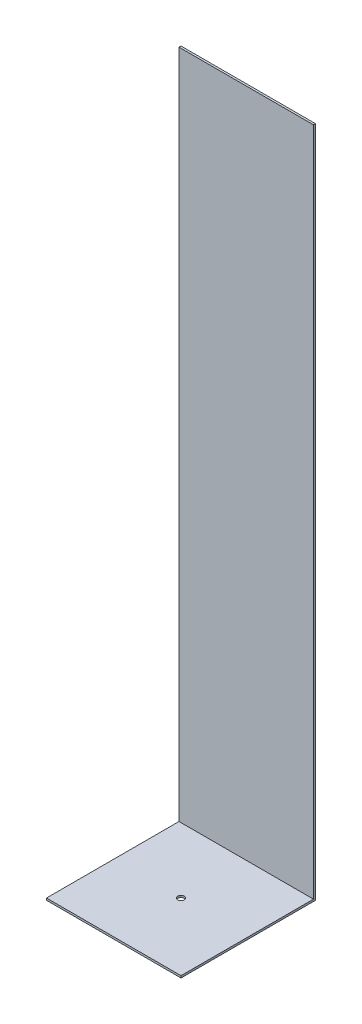
ISO-10303-21;
HEADER;
FILE_DESCRIPTION(('STEP AP214'),'2;1');
FILE_NAME('part.step','',(''),(''),'','','');
FILE_SCHEMA(('AUTOMOTIVE_DESIGN { 1 0 10303 214 1 1 1 1 }'));
ENDSEC;
DATA;
#1=APPLICATION_CONTEXT('core data for automotive mechanical design processes');
#2=APPLICATION_PROTOCOL_DEFINITION('international standard','automotive_design',2000,#1);
#3=PRODUCT_CONTEXT('',#1,'mechanical');
#4=PRODUCT('Part','Part','',(#3));
#5=PRODUCT_RELATED_PRODUCT_CATEGORY('part','',(#4));
#6=PRODUCT_DEFINITION_FORMATION('','',#4);
#7=PRODUCT_DEFINITION_CONTEXT('part definition',#1,'design');
#8=PRODUCT_DEFINITION('design','',#6,#7);
#9=PRODUCT_DEFINITION_SHAPE('','',#8);
#10=(LENGTH_UNIT() NAMED_UNIT(*) SI_UNIT(.MILLI.,.METRE.));
#11=(NAMED_UNIT(*) PLANE_ANGLE_UNIT() SI_UNIT($,.RADIAN.));
#12=(NAMED_UNIT(*) SI_UNIT($,.STERADIAN.) SOLID_ANGLE_UNIT());
#13=UNCERTAINTY_MEASURE_WITH_UNIT(LENGTH_MEASURE(1.E-05),#10,'distance_accuracy_value','');
#14=(GEOMETRIC_REPRESENTATION_CONTEXT(3) GLOBAL_UNCERTAINTY_ASSIGNED_CONTEXT((#13)) GLOBAL_UNIT_ASSIGNED_CONTEXT((#10,
#11,#12)) REPRESENTATION_CONTEXT('',''));
#15=CARTESIAN_POINT('',(0.,0.,0.));
#16=DIRECTION('',(0.,0.,1.));
#17=DIRECTION('',(1.,0.,0.));
#18=AXIS2_PLACEMENT_3D('',#15,#16,#17);
#19=CARTESIAN_POINT('',(-200.,-497.,-1.53080849893419E-13));
#20=DIRECTION('',(0.,1.,0.));
#21=DIRECTION('',(0.,0.,1.));
#22=AXIS2_PLACEMENT_3D('',#19,#20,#21);
#23=PLANE('',#22);
#24=CARTESIAN_POINT('',(-100.,-497.,99.9999999999999));
#25=DIRECTION('',(0.,1.,0.));
#26=DIRECTION('',(0.,0.,1.));
#27=AXIS2_PLACEMENT_3D('',#24,#25,#26);
#28=CIRCLE('',#27,5.00000000000001);
#29=CARTESIAN_POINT('',(-100.,-497.,105.));
#30=VERTEX_POINT('',#29);
#31=EDGE_CURVE('E132',#30,#30,#28,.T.);
#32=ORIENTED_EDGE('',*,*,#31,.F.);
#33=EDGE_LOOP('',(#32));
#34=FACE_BOUND('',#33,.T.);
#35=DIRECTION('',(0.,0.,-1.));
#36=VECTOR('',#35,1.);
#37=CARTESIAN_POINT('',(0.,-497.,-1.53080849893419E-13));
#38=LINE('',#37,#36);
#39=CARTESIAN_POINT('',(0.,-497.,2.99999999999985));
#40=VERTEX_POINT('',#39);
#41=CARTESIAN_POINT('',(0.,-497.,200.));
#42=VERTEX_POINT('',#41);
#43=EDGE_CURVE('E127',#40,#42,#38,.F.);
#44=ORIENTED_EDGE('',*,*,#43,.F.);
#45=DIRECTION('',(1.,0.,0.));
#46=VECTOR('',#45,1.);
#47=CARTESIAN_POINT('',(-200.,-497.,2.99999999999985));
#48=LINE('',#47,#46);
#49=CARTESIAN_POINT('',(-200.,-497.,2.99999999999985));
#50=VERTEX_POINT('',#49);
#51=EDGE_CURVE('E11',#50,#40,#48,.T.);
#52=ORIENTED_EDGE('',*,*,#51,.F.);
#53=DIRECTION('',(0.,0.,-1.));
#54=VECTOR('',#53,1.);
#55=CARTESIAN_POINT('',(-200.,-497.,-1.53080849893419E-13));
#56=LINE('',#55,#54);
#57=CARTESIAN_POINT('',(-200.,-497.,200.));
#58=VERTEX_POINT('',#57);
#59=EDGE_CURVE('E147',#50,#58,#56,.F.);
#60=ORIENTED_EDGE('',*,*,#59,.T.);
#61=DIRECTION('',(1.,0.,0.));
#62=VECTOR('',#61,1.);
#63=CARTESIAN_POINT('',(-200.,-497.,200.));
#64=LINE('',#63,#62);
#65=EDGE_CURVE('E42',#58,#42,#64,.T.);
#66=ORIENTED_EDGE('',*,*,#65,.T.);
#67=EDGE_LOOP('',(#44,#52,#60,#66));
#68=FACE_BOUND('',#67,.T.);
#69=ADVANCED_FACE('F39',(#34,#68),#23,.T.);
#70=CARTESIAN_POINT('',(-200.,500.,3.00000000000015));
#71=DIRECTION('',(0.,0.,1.));
#72=DIRECTION('',(0.,-1.,0.));
#73=AXIS2_PLACEMENT_3D('',#70,#71,#72);
#74=PLANE('',#73);
#75=DIRECTION('',(0.,-1.,0.));
#76=VECTOR('',#75,1.);
#77=CARTESIAN_POINT('',(0.,500.,3.00000000000015));
#78=LINE('',#77,#76);
#79=CARTESIAN_POINT('',(0.,500.,3.00000000000015));
#80=VERTEX_POINT('',#79);
#81=EDGE_CURVE('E144',#80,#40,#78,.T.);
#82=ORIENTED_EDGE('',*,*,#81,.F.);
#83=DIRECTION('',(1.,0.,0.));
#84=VECTOR('',#83,1.);
#85=CARTESIAN_POINT('',(-200.,500.,3.00000000000015));
#86=LINE('',#85,#84);
#87=CARTESIAN_POINT('',(-200.,500.,3.00000000000015));
#88=VERTEX_POINT('',#87);
#89=EDGE_CURVE('E49',#88,#80,#86,.T.);
#90=ORIENTED_EDGE('',*,*,#89,.F.);
#91=DIRECTION('',(0.,-1.,0.));
#92=VECTOR('',#91,1.);
#93=CARTESIAN_POINT('',(-200.,500.,3.00000000000015));
#94=LINE('',#93,#92);
#95=EDGE_CURVE('E103',#88,#50,#94,.T.);
#96=ORIENTED_EDGE('',*,*,#95,.T.);
#97=ORIENTED_EDGE('',*,*,#51,.T.);
#98=EDGE_LOOP('',(#82,#90,#96,#97));
#99=FACE_BOUND('',#98,.T.);
#100=ADVANCED_FACE('F163',(#99),#74,.T.);
#101=CARTESIAN_POINT('',(-200.,500.,3.00000000000015));
#102=DIRECTION('',(0.,-1.,0.));
#103=DIRECTION('',(0.,0.,-1.));
#104=AXIS2_PLACEMENT_3D('',#101,#102,#103);
#105=PLANE('',#104);
#106=DIRECTION('',(0.,0.,-1.));
#107=VECTOR('',#106,1.);
#108=CARTESIAN_POINT('',(0.,500.,3.00000000000015));
#109=LINE('',#108,#107);
#110=CARTESIAN_POINT('',(0.,500.,1.53080849893419E-13));
#111=VERTEX_POINT('',#110);
#112=EDGE_CURVE('E109',#80,#111,#109,.T.);
#113=ORIENTED_EDGE('',*,*,#112,.T.);
#114=DIRECTION('',(1.,0.,0.));
#115=VECTOR('',#114,1.);
#116=CARTESIAN_POINT('',(-200.,500.,1.53080849893419E-13));
#117=LINE('',#116,#115);
#118=CARTESIAN_POINT('',(-200.,500.,1.53080849893419E-13));
#119=VERTEX_POINT('',#118);
#120=EDGE_CURVE('E107',#119,#111,#117,.T.);
#121=ORIENTED_EDGE('',*,*,#120,.F.);
#122=DIRECTION('',(0.,0.,-1.));
#123=VECTOR('',#122,1.);
#124=CARTESIAN_POINT('',(-200.,500.,3.00000000000015));
#125=LINE('',#124,#123);
#126=EDGE_CURVE('E97',#88,#119,#125,.T.);
#127=ORIENTED_EDGE('',*,*,#126,.F.);
#128=ORIENTED_EDGE('',*,*,#89,.T.);
#129=EDGE_LOOP('',(#113,#121,#127,#128));
#130=FACE_BOUND('',#129,.T.);
#131=ADVANCED_FACE('F108',(#130),#105,.F.);
#132=CARTESIAN_POINT('',(-200.,500.,1.53080849893419E-13));
#133=DIRECTION('',(0.,0.,1.));
#134=DIRECTION('',(0.,-1.,0.));
#135=AXIS2_PLACEMENT_3D('',#132,#133,#134);
#136=PLANE('',#135);
#137=DIRECTION('',(0.,-1.,0.));
#138=VECTOR('',#137,1.);
#139=CARTESIAN_POINT('',(0.,500.,1.53080849893419E-13));
#140=LINE('',#139,#138);
#141=CARTESIAN_POINT('',(0.,-500.,-1.53080849893419E-13));
#142=VERTEX_POINT('',#141);
#143=EDGE_CURVE('E139',#111,#142,#140,.T.);
#144=ORIENTED_EDGE('',*,*,#143,.T.);
#145=DIRECTION('',(1.,0.,0.));
#146=VECTOR('',#145,1.);
#147=CARTESIAN_POINT('',(-200.,-500.,-1.53080849893419E-13));
#148=LINE('',#147,#146);
#149=CARTESIAN_POINT('',(-200.,-500.,-1.53080849893419E-13));
#150=VERTEX_POINT('',#149);
#151=EDGE_CURVE('E113',#150,#142,#148,.T.);
#152=ORIENTED_EDGE('',*,*,#151,.F.);
#153=DIRECTION('',(0.,-1.,0.));
#154=VECTOR('',#153,1.);
#155=CARTESIAN_POINT('',(-200.,500.,1.53080849893419E-13));
#156=LINE('',#155,#154);
#157=EDGE_CURVE('E101',#119,#150,#156,.T.);
#158=ORIENTED_EDGE('',*,*,#157,.F.);
#159=ORIENTED_EDGE('',*,*,#120,.T.);
#160=EDGE_LOOP('',(#144,#152,#158,#159));
#161=FACE_BOUND('',#160,.T.);
#162=ADVANCED_FACE('F115',(#161),#136,.F.);
#163=CARTESIAN_POINT('',(-200.,-500.,-1.53080849893419E-13));
#164=DIRECTION('',(0.,1.,0.));
#165=DIRECTION('',(0.,0.,1.));
#166=AXIS2_PLACEMENT_3D('',#163,#164,#165);
#167=PLANE('',#166);
#168=CARTESIAN_POINT('',(-100.,-500.,99.9999999999999));
#169=DIRECTION('',(0.,-1.,0.));
#170=DIRECTION('',(0.,0.,-1.));
#171=AXIS2_PLACEMENT_3D('',#168,#169,#170);
#172=CIRCLE('',#171,5.00000000000001);
#173=CARTESIAN_POINT('',(-100.,-500.,94.9999999999999));
#174=VERTEX_POINT('',#173);
#175=EDGE_CURVE('E198',#174,#174,#172,.T.);
#176=ORIENTED_EDGE('',*,*,#175,.F.);
#177=EDGE_LOOP('',(#176));
#178=FACE_BOUND('',#177,.T.);
#179=DIRECTION('',(0.,0.,1.));
#180=VECTOR('',#179,1.);
#181=CARTESIAN_POINT('',(0.,-500.,-1.53080849893419E-13));
#182=LINE('',#181,#180);
#183=CARTESIAN_POINT('',(0.,-500.,200.));
#184=VERTEX_POINT('',#183);
#185=EDGE_CURVE('E136',#142,#184,#182,.T.);
#186=ORIENTED_EDGE('',*,*,#185,.T.);
#187=DIRECTION('',(1.,0.,0.));
#188=VECTOR('',#187,1.);
#189=CARTESIAN_POINT('',(-200.,-500.,200.));
#190=LINE('',#189,#188);
#191=CARTESIAN_POINT('',(-200.,-500.,200.));
#192=VERTEX_POINT('',#191);
#193=EDGE_CURVE('E152',#192,#184,#190,.T.);
#194=ORIENTED_EDGE('',*,*,#193,.F.);
#195=DIRECTION('',(0.,0.,1.));
#196=VECTOR('',#195,1.);
#197=CARTESIAN_POINT('',(-200.,-500.,-1.53080849893419E-13));
#198=LINE('',#197,#196);
#199=EDGE_CURVE('E119',#150,#192,#198,.T.);
#200=ORIENTED_EDGE('',*,*,#199,.F.);
#201=ORIENTED_EDGE('',*,*,#151,.T.);
#202=EDGE_LOOP('',(#186,#194,#200,#201));
#203=FACE_BOUND('',#202,.T.);
#204=ADVANCED_FACE('F177',(#178,#203),#167,.F.);
#205=CARTESIAN_POINT('',(-200.,-500.,200.));
#206=DIRECTION('',(0.,0.,-1.));
#207=DIRECTION('',(-1.,0.,0.));
#208=AXIS2_PLACEMENT_3D('',#205,#206,#207);
#209=PLANE('',#208);
#210=DIRECTION('',(0.,1.,0.));
#211=VECTOR('',#210,1.);
#212=CARTESIAN_POINT('',(0.,-500.,200.));
#213=LINE('',#212,#211);
#214=EDGE_CURVE('E131',#184,#42,#213,.T.);
#215=ORIENTED_EDGE('',*,*,#214,.T.);
#216=ORIENTED_EDGE('',*,*,#65,.F.);
#217=DIRECTION('',(0.,1.,0.));
#218=VECTOR('',#217,1.);
#219=CARTESIAN_POINT('',(-200.,-500.,200.));
#220=LINE('',#219,#218);
#221=EDGE_CURVE('E89',#192,#58,#220,.T.);
#222=ORIENTED_EDGE('',*,*,#221,.F.);
#223=ORIENTED_EDGE('',*,*,#193,.T.);
#224=EDGE_LOOP('',(#215,#216,#222,#223));
#225=FACE_BOUND('',#224,.T.);
#226=ADVANCED_FACE('F159',(#225),#209,.F.);
#227=CARTESIAN_POINT('',(-200.,0.,0.));
#228=DIRECTION('',(1.,0.,0.));
#229=DIRECTION('',(0.,0.,-1.));
#230=AXIS2_PLACEMENT_3D('',#227,#228,#229);
#231=PLANE('',#230);
#232=ORIENTED_EDGE('',*,*,#59,.F.);
#233=ORIENTED_EDGE('',*,*,#95,.F.);
#234=ORIENTED_EDGE('',*,*,#126,.T.);
#235=ORIENTED_EDGE('',*,*,#157,.T.);
#236=ORIENTED_EDGE('',*,*,#199,.T.);
#237=ORIENTED_EDGE('',*,*,#221,.T.);
#238=EDGE_LOOP('',(#232,#233,#234,#235,#236,#237));
#239=FACE_BOUND('',#238,.T.);
#240=ADVANCED_FACE('F99',(#239),#231,.F.);
#241=CARTESIAN_POINT('',(0.,0.,0.));
#242=DIRECTION('',(1.,0.,0.));
#243=DIRECTION('',(0.,0.,-1.));
#244=AXIS2_PLACEMENT_3D('',#241,#242,#243);
#245=PLANE('',#244);
#246=ORIENTED_EDGE('',*,*,#43,.T.);
#247=ORIENTED_EDGE('',*,*,#214,.F.);
#248=ORIENTED_EDGE('',*,*,#185,.F.);
#249=ORIENTED_EDGE('',*,*,#143,.F.);
#250=ORIENTED_EDGE('',*,*,#112,.F.);
#251=ORIENTED_EDGE('',*,*,#81,.T.);
#252=EDGE_LOOP('',(#246,#247,#248,#249,#250,#251));
#253=FACE_BOUND('',#252,.T.);
#254=ADVANCED_FACE('F162',(#253),#245,.T.);
#255=CARTESIAN_POINT('',(-100.,-490.,99.9999999999999));
#256=DIRECTION('',(0.,-1.,0.));
#257=DIRECTION('',(0.,0.,-1.));
#258=AXIS2_PLACEMENT_3D('',#255,#256,#257);
#259=CYLINDRICAL_SURFACE('',#258,5.00000000000001);
#260=ORIENTED_EDGE('',*,*,#31,.T.);
#261=EDGE_LOOP('',(#260));
#262=FACE_BOUND('',#261,.T.);
#263=ORIENTED_EDGE('',*,*,#175,.T.);
#264=EDGE_LOOP('',(#263));
#265=FACE_BOUND('',#264,.T.);
#266=ADVANCED_FACE('F187',(#262,#265),#259,.F.);
#267=CLOSED_SHELL('',(#69,#100,#131,#162,#204,#226,#240,#254,#266));
#268=MANIFOLD_SOLID_BREP('B2',#267);
#269=ADVANCED_BREP_SHAPE_REPRESENTATION('',(#18,#268),#14);
#270=SHAPE_DEFINITION_REPRESENTATION(#9,#269);
ENDSEC;
END-ISO-10303-21;
